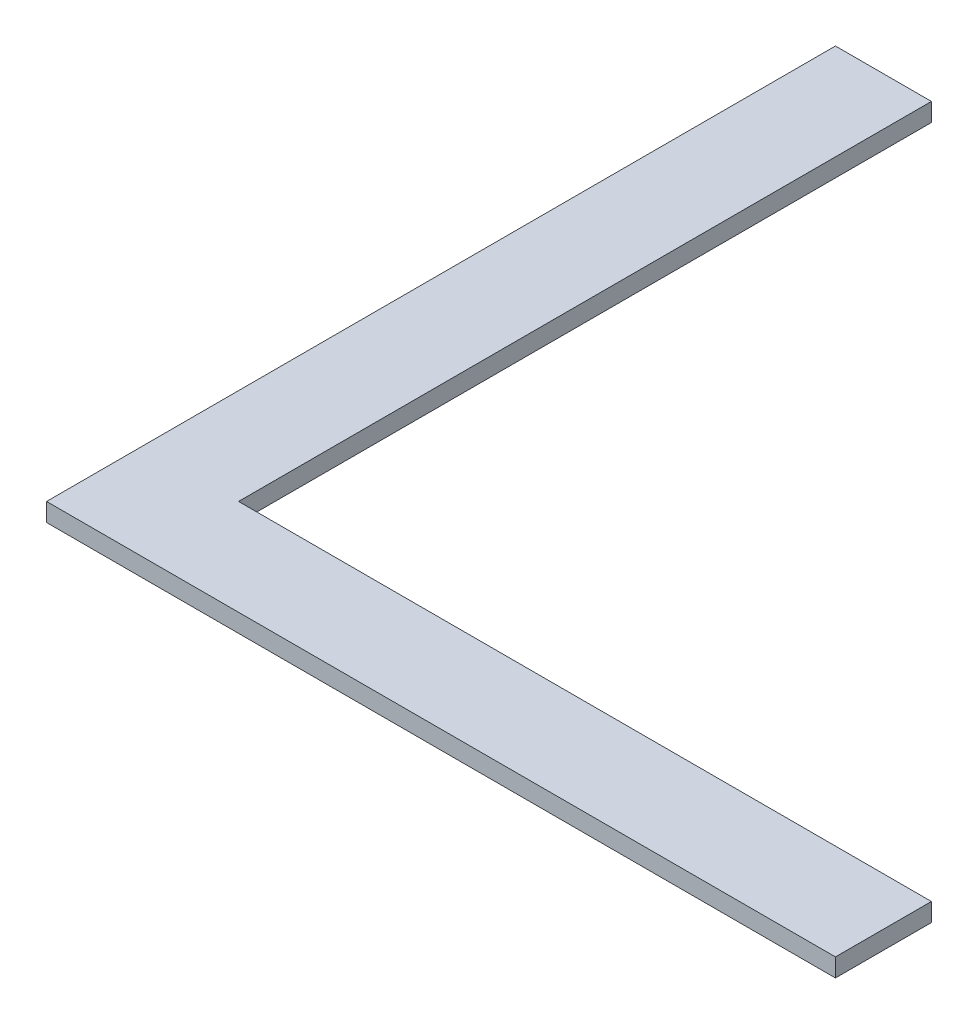
ISO-10303-21;
HEADER;
FILE_DESCRIPTION(('STEP AP214'),'2;1');
FILE_NAME('part.step','',(''),(''),'','','');
FILE_SCHEMA(('AUTOMOTIVE_DESIGN { 1 0 10303 214 1 1 1 1 }'));
ENDSEC;
DATA;
#1=APPLICATION_CONTEXT('core data for automotive mechanical design processes');
#2=APPLICATION_PROTOCOL_DEFINITION('international standard','automotive_design',2000,#1);
#3=PRODUCT_CONTEXT('',#1,'mechanical');
#4=PRODUCT('Part','Part','',(#3));
#5=PRODUCT_RELATED_PRODUCT_CATEGORY('part','',(#4));
#6=PRODUCT_DEFINITION_FORMATION('','',#4);
#7=PRODUCT_DEFINITION_CONTEXT('part definition',#1,'design');
#8=PRODUCT_DEFINITION('design','',#6,#7);
#9=PRODUCT_DEFINITION_SHAPE('','',#8);
#10=(LENGTH_UNIT() NAMED_UNIT(*) SI_UNIT(.MILLI.,.METRE.));
#11=(NAMED_UNIT(*) PLANE_ANGLE_UNIT() SI_UNIT($,.RADIAN.));
#12=(NAMED_UNIT(*) SI_UNIT($,.STERADIAN.) SOLID_ANGLE_UNIT());
#13=UNCERTAINTY_MEASURE_WITH_UNIT(LENGTH_MEASURE(1.E-05),#10,'distance_accuracy_value','');
#14=(GEOMETRIC_REPRESENTATION_CONTEXT(3) GLOBAL_UNCERTAINTY_ASSIGNED_CONTEXT((#13)) GLOBAL_UNIT_ASSIGNED_CONTEXT((#10,
#11,#12)) REPRESENTATION_CONTEXT('',''));
#15=CARTESIAN_POINT('',(0.,0.,0.));
#16=DIRECTION('',(0.,0.,1.));
#17=DIRECTION('',(1.,0.,0.));
#18=AXIS2_PLACEMENT_3D('',#15,#16,#17);
#19=CARTESIAN_POINT('',(0.,1.,-37.9));
#20=DIRECTION('',(0.,0.,1.));
#21=DIRECTION('',(1.,0.,0.));
#22=AXIS2_PLACEMENT_3D('',#19,#20,#21);
#23=PLANE('',#22);
#24=DIRECTION('',(-1.,0.,0.));
#25=VECTOR('',#24,1.);
#26=CARTESIAN_POINT('',(0.,0.,-37.9));
#27=LINE('',#26,#25);
#28=CARTESIAN_POINT('',(0.,0.,-37.9));
#29=VERTEX_POINT('',#28);
#30=CARTESIAN_POINT('',(-5.25,0.,-37.9));
#31=VERTEX_POINT('',#30);
#32=EDGE_CURVE('E128',#29,#31,#27,.T.);
#33=ORIENTED_EDGE('',*,*,#32,.T.);
#34=DIRECTION('',(0.,-1.,0.));
#35=VECTOR('',#34,1.);
#36=CARTESIAN_POINT('',(-5.25,1.,-37.9));
#37=LINE('',#36,#35);
#38=CARTESIAN_POINT('',(-5.25,1.,-37.9));
#39=VERTEX_POINT('',#38);
#40=EDGE_CURVE('E11',#39,#31,#37,.T.);
#41=ORIENTED_EDGE('',*,*,#40,.F.);
#42=DIRECTION('',(-1.,0.,0.));
#43=VECTOR('',#42,1.);
#44=CARTESIAN_POINT('',(0.,1.,-37.9));
#45=LINE('',#44,#43);
#46=CARTESIAN_POINT('',(0.,1.,-37.9));
#47=VERTEX_POINT('',#46);
#48=EDGE_CURVE('E144',#47,#39,#45,.T.);
#49=ORIENTED_EDGE('',*,*,#48,.F.);
#50=DIRECTION('',(0.,-1.,0.));
#51=VECTOR('',#50,1.);
#52=CARTESIAN_POINT('',(0.,1.,-37.9));
#53=LINE('',#52,#51);
#54=EDGE_CURVE('E124',#47,#29,#53,.T.);
#55=ORIENTED_EDGE('',*,*,#54,.T.);
#56=EDGE_LOOP('',(#33,#41,#49,#55));
#57=FACE_BOUND('',#56,.T.);
#58=ADVANCED_FACE('F39',(#57),#23,.F.);
#59=CARTESIAN_POINT('',(-5.25,1.,-37.9));
#60=DIRECTION('',(1.,0.,0.));
#61=DIRECTION('',(0.,0.,-1.));
#62=AXIS2_PLACEMENT_3D('',#59,#60,#61);
#63=PLANE('',#62);
#64=DIRECTION('',(0.,0.,1.));
#65=VECTOR('',#64,1.);
#66=CARTESIAN_POINT('',(-5.25,0.,-37.9));
#67=LINE('',#66,#65);
#68=CARTESIAN_POINT('',(-5.25,0.,5.24999999999999));
#69=VERTEX_POINT('',#68);
#70=EDGE_CURVE('E132',#31,#69,#67,.T.);
#71=ORIENTED_EDGE('',*,*,#70,.T.);
#72=DIRECTION('',(0.,-1.,0.));
#73=VECTOR('',#72,1.);
#74=CARTESIAN_POINT('',(-5.25,1.,5.24999999999999));
#75=LINE('',#74,#73);
#76=CARTESIAN_POINT('',(-5.25,1.,5.24999999999999));
#77=VERTEX_POINT('',#76);
#78=EDGE_CURVE('E48',#77,#69,#75,.T.);
#79=ORIENTED_EDGE('',*,*,#78,.F.);
#80=DIRECTION('',(0.,0.,1.));
#81=VECTOR('',#80,1.);
#82=CARTESIAN_POINT('',(-5.25,1.,-37.9));
#83=LINE('',#82,#81);
#84=EDGE_CURVE('E93',#39,#77,#83,.T.);
#85=ORIENTED_EDGE('',*,*,#84,.F.);
#86=ORIENTED_EDGE('',*,*,#40,.T.);
#87=EDGE_LOOP('',(#71,#79,#85,#86));
#88=FACE_BOUND('',#87,.T.);
#89=ADVANCED_FACE('F172',(#88),#63,.F.);
#90=CARTESIAN_POINT('',(-5.25,1.,5.24999999999999));
#91=DIRECTION('',(0.,0.,-1.));
#92=DIRECTION('',(-1.,0.,0.));
#93=AXIS2_PLACEMENT_3D('',#90,#91,#92);
#94=PLANE('',#93);
#95=DIRECTION('',(1.,0.,0.));
#96=VECTOR('',#95,1.);
#97=CARTESIAN_POINT('',(-5.25,0.,5.24999999999999));
#98=LINE('',#97,#96);
#99=CARTESIAN_POINT('',(37.9,0.,5.25));
#100=VERTEX_POINT('',#99);
#101=EDGE_CURVE('E135',#69,#100,#98,.T.);
#102=ORIENTED_EDGE('',*,*,#101,.T.);
#103=DIRECTION('',(0.,-1.,0.));
#104=VECTOR('',#103,1.);
#105=CARTESIAN_POINT('',(37.9,1.,5.25));
#106=LINE('',#105,#104);
#107=CARTESIAN_POINT('',(37.9,1.,5.25));
#108=VERTEX_POINT('',#107);
#109=EDGE_CURVE('E117',#108,#100,#106,.T.);
#110=ORIENTED_EDGE('',*,*,#109,.F.);
#111=DIRECTION('',(1.,0.,0.));
#112=VECTOR('',#111,1.);
#113=CARTESIAN_POINT('',(-5.25,1.,5.24999999999999));
#114=LINE('',#113,#112);
#115=EDGE_CURVE('E106',#77,#108,#114,.T.);
#116=ORIENTED_EDGE('',*,*,#115,.F.);
#117=ORIENTED_EDGE('',*,*,#78,.T.);
#118=EDGE_LOOP('',(#102,#110,#116,#117));
#119=FACE_BOUND('',#118,.T.);
#120=ADVANCED_FACE('F154',(#119),#94,.F.);
#121=CARTESIAN_POINT('',(37.9,1.,5.25));
#122=DIRECTION('',(-1.,0.,0.));
#123=DIRECTION('',(0.,0.,1.));
#124=AXIS2_PLACEMENT_3D('',#121,#122,#123);
#125=PLANE('',#124);
#126=DIRECTION('',(0.,0.,-1.));
#127=VECTOR('',#126,1.);
#128=CARTESIAN_POINT('',(37.9,0.,5.25));
#129=LINE('',#128,#127);
#130=CARTESIAN_POINT('',(37.9,0.,0.));
#131=VERTEX_POINT('',#130);
#132=EDGE_CURVE('E115',#100,#131,#129,.T.);
#133=ORIENTED_EDGE('',*,*,#132,.T.);
#134=DIRECTION('',(0.,-1.,0.));
#135=VECTOR('',#134,1.);
#136=CARTESIAN_POINT('',(37.9,1.,0.));
#137=LINE('',#136,#135);
#138=CARTESIAN_POINT('',(37.9,1.,0.));
#139=VERTEX_POINT('',#138);
#140=EDGE_CURVE('E112',#139,#131,#137,.T.);
#141=ORIENTED_EDGE('',*,*,#140,.F.);
#142=DIRECTION('',(0.,0.,-1.));
#143=VECTOR('',#142,1.);
#144=CARTESIAN_POINT('',(37.9,1.,5.25));
#145=LINE('',#144,#143);
#146=EDGE_CURVE('E100',#108,#139,#145,.T.);
#147=ORIENTED_EDGE('',*,*,#146,.F.);
#148=ORIENTED_EDGE('',*,*,#109,.T.);
#149=EDGE_LOOP('',(#133,#141,#147,#148));
#150=FACE_BOUND('',#149,.T.);
#151=ADVANCED_FACE('F113',(#150),#125,.F.);
#152=CARTESIAN_POINT('',(37.9,1.,0.));
#153=DIRECTION('',(0.,0.,1.));
#154=DIRECTION('',(1.,0.,0.));
#155=AXIS2_PLACEMENT_3D('',#152,#153,#154);
#156=PLANE('',#155);
#157=DIRECTION('',(-1.,0.,0.));
#158=VECTOR('',#157,1.);
#159=CARTESIAN_POINT('',(37.9,0.,0.));
#160=LINE('',#159,#158);
#161=CARTESIAN_POINT('',(0.,0.,0.));
#162=VERTEX_POINT('',#161);
#163=EDGE_CURVE('E79',#131,#162,#160,.T.);
#164=ORIENTED_EDGE('',*,*,#163,.T.);
#165=DIRECTION('',(0.,-1.,0.));
#166=VECTOR('',#165,1.);
#167=CARTESIAN_POINT('',(0.,1.,0.));
#168=LINE('',#167,#166);
#169=CARTESIAN_POINT('',(0.,1.,0.));
#170=VERTEX_POINT('',#169);
#171=EDGE_CURVE('E118',#170,#162,#168,.T.);
#172=ORIENTED_EDGE('',*,*,#171,.F.);
#173=DIRECTION('',(-1.,0.,0.));
#174=VECTOR('',#173,1.);
#175=CARTESIAN_POINT('',(37.9,1.,0.));
#176=LINE('',#175,#174);
#177=EDGE_CURVE('E104',#139,#170,#176,.T.);
#178=ORIENTED_EDGE('',*,*,#177,.F.);
#179=ORIENTED_EDGE('',*,*,#140,.T.);
#180=EDGE_LOOP('',(#164,#172,#178,#179));
#181=FACE_BOUND('',#180,.T.);
#182=ADVANCED_FACE('F120',(#181),#156,.F.);
#183=CARTESIAN_POINT('',(0.,1.,0.));
#184=DIRECTION('',(-1.,0.,0.));
#185=DIRECTION('',(0.,0.,1.));
#186=AXIS2_PLACEMENT_3D('',#183,#184,#185);
#187=PLANE('',#186);
#188=DIRECTION('',(0.,0.,-1.));
#189=VECTOR('',#188,1.);
#190=CARTESIAN_POINT('',(0.,0.,0.));
#191=LINE('',#190,#189);
#192=EDGE_CURVE('E85',#162,#29,#191,.T.);
#193=ORIENTED_EDGE('',*,*,#192,.T.);
#194=ORIENTED_EDGE('',*,*,#54,.F.);
#195=DIRECTION('',(0.,0.,-1.));
#196=VECTOR('',#195,1.);
#197=CARTESIAN_POINT('',(0.,1.,0.));
#198=LINE('',#197,#196);
#199=EDGE_CURVE('E56',#170,#47,#198,.T.);
#200=ORIENTED_EDGE('',*,*,#199,.F.);
#201=ORIENTED_EDGE('',*,*,#171,.T.);
#202=EDGE_LOOP('',(#193,#194,#200,#201));
#203=FACE_BOUND('',#202,.T.);
#204=ADVANCED_FACE('F161',(#203),#187,.F.);
#205=CARTESIAN_POINT('',(0.,1.,0.));
#206=DIRECTION('',(0.,1.,0.));
#207=DIRECTION('',(0.,0.,1.));
#208=AXIS2_PLACEMENT_3D('',#205,#206,#207);
#209=PLANE('',#208);
#210=ORIENTED_EDGE('',*,*,#48,.T.);
#211=ORIENTED_EDGE('',*,*,#84,.T.);
#212=ORIENTED_EDGE('',*,*,#115,.T.);
#213=ORIENTED_EDGE('',*,*,#146,.T.);
#214=ORIENTED_EDGE('',*,*,#177,.T.);
#215=ORIENTED_EDGE('',*,*,#199,.T.);
#216=EDGE_LOOP('',(#210,#211,#212,#213,#214,#215));
#217=FACE_BOUND('',#216,.T.);
#218=ADVANCED_FACE('F102',(#217),#209,.T.);
#219=CARTESIAN_POINT('',(0.,0.,0.));
#220=DIRECTION('',(0.,1.,0.));
#221=DIRECTION('',(0.,0.,1.));
#222=AXIS2_PLACEMENT_3D('',#219,#220,#221);
#223=PLANE('',#222);
#224=ORIENTED_EDGE('',*,*,#32,.F.);
#225=ORIENTED_EDGE('',*,*,#192,.F.);
#226=ORIENTED_EDGE('',*,*,#163,.F.);
#227=ORIENTED_EDGE('',*,*,#132,.F.);
#228=ORIENTED_EDGE('',*,*,#101,.F.);
#229=ORIENTED_EDGE('',*,*,#70,.F.);
#230=EDGE_LOOP('',(#224,#225,#226,#227,#228,#229));
#231=FACE_BOUND('',#230,.T.);
#232=ADVANCED_FACE('F157',(#231),#223,.F.);
#233=CLOSED_SHELL('',(#58,#89,#120,#151,#182,#204,#218,#232));
#234=MANIFOLD_SOLID_BREP('B2',#233);
#235=ADVANCED_BREP_SHAPE_REPRESENTATION('',(#18,#234),#14);
#236=SHAPE_DEFINITION_REPRESENTATION(#9,#235);
ENDSEC;
END-ISO-10303-21;
